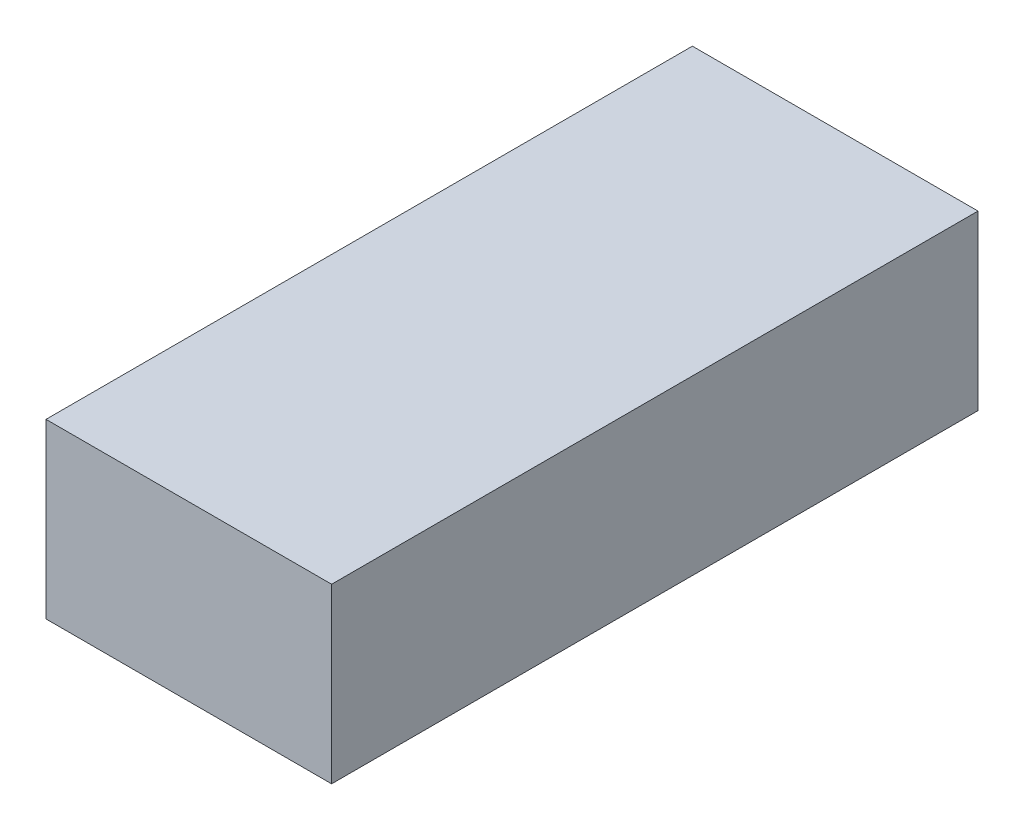
ISO-10303-21;
HEADER;
FILE_DESCRIPTION(('STEP AP214'),'2;1');
FILE_NAME('part.step','',(''),(''),'','','');
FILE_SCHEMA(('AUTOMOTIVE_DESIGN { 1 0 10303 214 1 1 1 1 }'));
ENDSEC;
DATA;
#1=APPLICATION_CONTEXT('core data for automotive mechanical design processes');
#2=APPLICATION_PROTOCOL_DEFINITION('international standard','automotive_design',2000,#1);
#3=PRODUCT_CONTEXT('',#1,'mechanical');
#4=PRODUCT('Part','Part','',(#3));
#5=PRODUCT_RELATED_PRODUCT_CATEGORY('part','',(#4));
#6=PRODUCT_DEFINITION_FORMATION('','',#4);
#7=PRODUCT_DEFINITION_CONTEXT('part definition',#1,'design');
#8=PRODUCT_DEFINITION('design','',#6,#7);
#9=PRODUCT_DEFINITION_SHAPE('','',#8);
#10=(LENGTH_UNIT() NAMED_UNIT(*) SI_UNIT(.MILLI.,.METRE.));
#11=(NAMED_UNIT(*) PLANE_ANGLE_UNIT() SI_UNIT($,.RADIAN.));
#12=(NAMED_UNIT(*) SI_UNIT($,.STERADIAN.) SOLID_ANGLE_UNIT());
#13=UNCERTAINTY_MEASURE_WITH_UNIT(LENGTH_MEASURE(1.E-05),#10,'distance_accuracy_value','');
#14=(GEOMETRIC_REPRESENTATION_CONTEXT(3) GLOBAL_UNCERTAINTY_ASSIGNED_CONTEXT((#13)) GLOBAL_UNIT_ASSIGNED_CONTEXT((#10,
#11,#12)) REPRESENTATION_CONTEXT('',''));
#15=CARTESIAN_POINT('',(0.,0.,0.));
#16=DIRECTION('',(0.,0.,1.));
#17=DIRECTION('',(1.,0.,0.));
#18=AXIS2_PLACEMENT_3D('',#15,#16,#17);
#19=CARTESIAN_POINT('',(-19.,0.,43.));
#20=DIRECTION('',(0.,0.,1.));
#21=DIRECTION('',(1.,0.,0.));
#22=AXIS2_PLACEMENT_3D('',#19,#20,#21);
#23=PLANE('',#22);
#24=DIRECTION('',(0.,1.,0.));
#25=VECTOR('',#24,1.);
#26=CARTESIAN_POINT('',(-19.,0.,43.));
#27=LINE('',#26,#25);
#28=CARTESIAN_POINT('',(-19.,0.,43.));
#29=VERTEX_POINT('',#28);
#30=CARTESIAN_POINT('',(-19.,23.,43.));
#31=VERTEX_POINT('',#30);
#32=EDGE_CURVE('E76',#29,#31,#27,.T.);
#33=ORIENTED_EDGE('',*,*,#32,.F.);
#34=DIRECTION('',(1.,0.,0.));
#35=VECTOR('',#34,1.);
#36=CARTESIAN_POINT('',(-19.,0.,43.));
#37=LINE('',#36,#35);
#38=CARTESIAN_POINT('',(19.,0.,43.));
#39=VERTEX_POINT('',#38);
#40=EDGE_CURVE('E72',#29,#39,#37,.T.);
#41=ORIENTED_EDGE('',*,*,#40,.T.);
#42=DIRECTION('',(0.,1.,0.));
#43=VECTOR('',#42,1.);
#44=CARTESIAN_POINT('',(19.,0.,43.));
#45=LINE('',#44,#43);
#46=CARTESIAN_POINT('',(19.,23.,43.));
#47=VERTEX_POINT('',#46);
#48=EDGE_CURVE('E20',#39,#47,#45,.T.);
#49=ORIENTED_EDGE('',*,*,#48,.T.);
#50=DIRECTION('',(1.,0.,0.));
#51=VECTOR('',#50,1.);
#52=CARTESIAN_POINT('',(-19.,23.,43.));
#53=LINE('',#52,#51);
#54=EDGE_CURVE('E11',#31,#47,#53,.T.);
#55=ORIENTED_EDGE('',*,*,#54,.F.);
#56=EDGE_LOOP('',(#33,#41,#49,#55));
#57=FACE_BOUND('',#56,.T.);
#58=ADVANCED_FACE('F17',(#57),#23,.T.);
#59=CARTESIAN_POINT('',(-19.,0.,-43.));
#60=DIRECTION('',(0.,0.,1.));
#61=DIRECTION('',(1.,0.,0.));
#62=AXIS2_PLACEMENT_3D('',#59,#60,#61);
#63=PLANE('',#62);
#64=DIRECTION('',(1.,0.,0.));
#65=VECTOR('',#64,1.);
#66=CARTESIAN_POINT('',(-19.,23.,-43.));
#67=LINE('',#66,#65);
#68=CARTESIAN_POINT('',(-19.,23.,-43.));
#69=VERTEX_POINT('',#68);
#70=CARTESIAN_POINT('',(19.,23.,-43.));
#71=VERTEX_POINT('',#70);
#72=EDGE_CURVE('E27',#69,#71,#67,.T.);
#73=ORIENTED_EDGE('',*,*,#72,.T.);
#74=DIRECTION('',(0.,1.,0.));
#75=VECTOR('',#74,1.);
#76=CARTESIAN_POINT('',(19.,0.,-43.));
#77=LINE('',#76,#75);
#78=CARTESIAN_POINT('',(19.,0.,-43.));
#79=VERTEX_POINT('',#78);
#80=EDGE_CURVE('E88',#79,#71,#77,.T.);
#81=ORIENTED_EDGE('',*,*,#80,.F.);
#82=DIRECTION('',(1.,0.,0.));
#83=VECTOR('',#82,1.);
#84=CARTESIAN_POINT('',(-19.,0.,-43.));
#85=LINE('',#84,#83);
#86=CARTESIAN_POINT('',(-19.,0.,-43.));
#87=VERTEX_POINT('',#86);
#88=EDGE_CURVE('E63',#87,#79,#85,.T.);
#89=ORIENTED_EDGE('',*,*,#88,.F.);
#90=DIRECTION('',(0.,1.,0.));
#91=VECTOR('',#90,1.);
#92=CARTESIAN_POINT('',(-19.,0.,-43.));
#93=LINE('',#92,#91);
#94=EDGE_CURVE('E96',#87,#69,#93,.T.);
#95=ORIENTED_EDGE('',*,*,#94,.T.);
#96=EDGE_LOOP('',(#73,#81,#89,#95));
#97=FACE_BOUND('',#96,.T.);
#98=ADVANCED_FACE('F134',(#97),#63,.F.);
#99=CARTESIAN_POINT('',(-19.,23.,-43.));
#100=DIRECTION('',(0.,1.,0.));
#101=DIRECTION('',(1.,0.,0.));
#102=AXIS2_PLACEMENT_3D('',#99,#100,#101);
#103=PLANE('',#102);
#104=ORIENTED_EDGE('',*,*,#72,.F.);
#105=DIRECTION('',(0.,0.,1.));
#106=VECTOR('',#105,1.);
#107=CARTESIAN_POINT('',(-19.,23.,-43.));
#108=LINE('',#107,#106);
#109=EDGE_CURVE('E173',#69,#31,#108,.T.);
#110=ORIENTED_EDGE('',*,*,#109,.T.);
#111=ORIENTED_EDGE('',*,*,#54,.T.);
#112=DIRECTION('',(0.,0.,1.));
#113=VECTOR('',#112,1.);
#114=CARTESIAN_POINT('',(19.,23.,-43.));
#115=LINE('',#114,#113);
#116=EDGE_CURVE('E84',#71,#47,#115,.T.);
#117=ORIENTED_EDGE('',*,*,#116,.F.);
#118=EDGE_LOOP('',(#104,#110,#111,#117));
#119=FACE_BOUND('',#118,.T.);
#120=ADVANCED_FACE('F126',(#119),#103,.T.);
#121=CARTESIAN_POINT('',(-19.,0.,-43.));
#122=DIRECTION('',(0.,1.,0.));
#123=DIRECTION('',(1.,0.,0.));
#124=AXIS2_PLACEMENT_3D('',#121,#122,#123);
#125=PLANE('',#124);
#126=DIRECTION('',(0.,0.,1.));
#127=VECTOR('',#126,1.);
#128=CARTESIAN_POINT('',(19.,0.,-43.));
#129=LINE('',#128,#127);
#130=EDGE_CURVE('E83',#79,#39,#129,.T.);
#131=ORIENTED_EDGE('',*,*,#130,.T.);
#132=ORIENTED_EDGE('',*,*,#40,.F.);
#133=DIRECTION('',(0.,0.,1.));
#134=VECTOR('',#133,1.);
#135=CARTESIAN_POINT('',(-19.,0.,-43.));
#136=LINE('',#135,#134);
#137=EDGE_CURVE('E89',#87,#29,#136,.T.);
#138=ORIENTED_EDGE('',*,*,#137,.F.);
#139=ORIENTED_EDGE('',*,*,#88,.T.);
#140=EDGE_LOOP('',(#131,#132,#138,#139));
#141=FACE_BOUND('',#140,.T.);
#142=ADVANCED_FACE('F86',(#141),#125,.F.);
#143=CARTESIAN_POINT('',(19.,0.,-43.));
#144=DIRECTION('',(1.,0.,0.));
#145=DIRECTION('',(0.,1.,0.));
#146=AXIS2_PLACEMENT_3D('',#143,#144,#145);
#147=PLANE('',#146);
#148=ORIENTED_EDGE('',*,*,#130,.F.);
#149=ORIENTED_EDGE('',*,*,#80,.T.);
#150=ORIENTED_EDGE('',*,*,#116,.T.);
#151=ORIENTED_EDGE('',*,*,#48,.F.);
#152=EDGE_LOOP('',(#148,#149,#150,#151));
#153=FACE_BOUND('',#152,.T.);
#154=ADVANCED_FACE('F81',(#153),#147,.T.);
#155=CARTESIAN_POINT('',(-19.,0.,-43.));
#156=DIRECTION('',(1.,0.,0.));
#157=DIRECTION('',(0.,1.,0.));
#158=AXIS2_PLACEMENT_3D('',#155,#156,#157);
#159=PLANE('',#158);
#160=ORIENTED_EDGE('',*,*,#32,.T.);
#161=ORIENTED_EDGE('',*,*,#109,.F.);
#162=ORIENTED_EDGE('',*,*,#94,.F.);
#163=ORIENTED_EDGE('',*,*,#137,.T.);
#164=EDGE_LOOP('',(#160,#161,#162,#163));
#165=FACE_BOUND('',#164,.T.);
#166=ADVANCED_FACE('F105',(#165),#159,.F.);
#167=CLOSED_SHELL('',(#58,#98,#120,#142,#154,#166));
#168=MANIFOLD_SOLID_BREP('B1',#167);
#169=ADVANCED_BREP_SHAPE_REPRESENTATION('',(#18,#168),#14);
#170=SHAPE_DEFINITION_REPRESENTATION(#9,#169);
ENDSEC;
END-ISO-10303-21;
